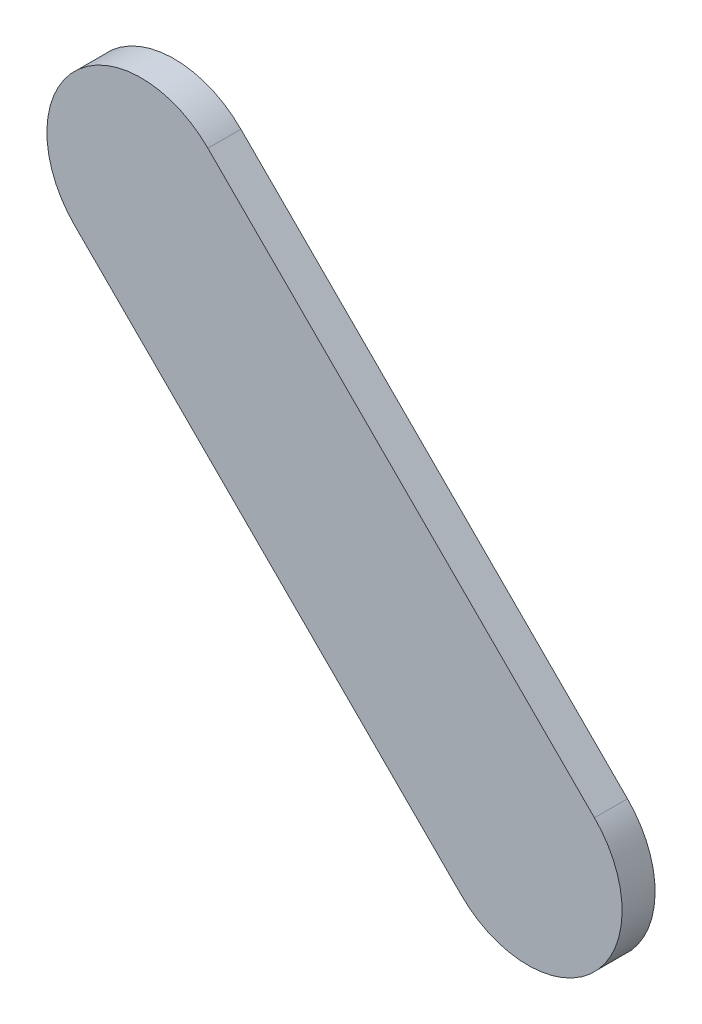
ISO-10303-21;
HEADER;
FILE_DESCRIPTION(('STEP AP214'),'2;1');
FILE_NAME('part.step','',(''),(''),'','','');
FILE_SCHEMA(('AUTOMOTIVE_DESIGN { 1 0 10303 214 1 1 1 1 }'));
ENDSEC;
DATA;
#1=APPLICATION_CONTEXT('core data for automotive mechanical design processes');
#2=APPLICATION_PROTOCOL_DEFINITION('international standard','automotive_design',2000,#1);
#3=PRODUCT_CONTEXT('',#1,'mechanical');
#4=PRODUCT('Part','Part','',(#3));
#5=PRODUCT_RELATED_PRODUCT_CATEGORY('part','',(#4));
#6=PRODUCT_DEFINITION_FORMATION('','',#4);
#7=PRODUCT_DEFINITION_CONTEXT('part definition',#1,'design');
#8=PRODUCT_DEFINITION('design','',#6,#7);
#9=PRODUCT_DEFINITION_SHAPE('','',#8);
#10=(LENGTH_UNIT() NAMED_UNIT(*) SI_UNIT(.MILLI.,.METRE.));
#11=(NAMED_UNIT(*) PLANE_ANGLE_UNIT() SI_UNIT($,.RADIAN.));
#12=(NAMED_UNIT(*) SI_UNIT($,.STERADIAN.) SOLID_ANGLE_UNIT());
#13=UNCERTAINTY_MEASURE_WITH_UNIT(LENGTH_MEASURE(1.E-05),#10,'distance_accuracy_value','');
#14=(GEOMETRIC_REPRESENTATION_CONTEXT(3) GLOBAL_UNCERTAINTY_ASSIGNED_CONTEXT((#13)) GLOBAL_UNIT_ASSIGNED_CONTEXT((#10,
#11,#12)) REPRESENTATION_CONTEXT('',''));
#15=CARTESIAN_POINT('',(0.,0.,0.));
#16=DIRECTION('',(0.,0.,1.));
#17=DIRECTION('',(1.,0.,0.));
#18=AXIS2_PLACEMENT_3D('',#15,#16,#17);
#19=CARTESIAN_POINT('',(95.07071,-123.479289,1.635));
#20=DIRECTION('',(0.,0.,1.));
#21=DIRECTION('',(1.,0.,0.));
#22=AXIS2_PLACEMENT_3D('',#19,#20,#21);
#23=PLANE('',#22);
#24=DIRECTION('',(-0.707106781186548,0.707106781186548,0.));
#25=VECTOR('',#24,1.);
#26=CARTESIAN_POINT('',(95.07071,-123.479289,1.635));
#27=LINE('',#26,#25);
#28=CARTESIAN_POINT('',(95.07071,-123.479289,1.635));
#29=VERTEX_POINT('',#28);
#30=CARTESIAN_POINT('',(94.66071,-123.069289,1.635));
#31=VERTEX_POINT('',#30);
#32=EDGE_CURVE('E97',#29,#31,#27,.T.);
#33=ORIENTED_EDGE('',*,*,#32,.T.);
#34=CARTESIAN_POINT('',(94.5899995,-123.1399995,1.635));
#35=DIRECTION('',(0.,0.,1.));
#36=DIRECTION('',(0.707106781186048,0.707106781187047,0.));
#37=AXIS2_PLACEMENT_3D('',#34,#35,#36);
#38=CIRCLE('',#37,0.09999974810219);
#39=CARTESIAN_POINT('',(94.519289,-123.21071,1.635));
#40=VERTEX_POINT('',#39);
#41=EDGE_CURVE('E76',#31,#40,#38,.T.);
#42=ORIENTED_EDGE('',*,*,#41,.T.);
#43=DIRECTION('',(0.707106781186548,-0.707106781186548,0.));
#44=VECTOR('',#43,1.);
#45=CARTESIAN_POINT('',(94.519289,-123.21071,1.635));
#46=LINE('',#45,#44);
#47=CARTESIAN_POINT('',(94.929289,-123.62071,1.635));
#48=VERTEX_POINT('',#47);
#49=EDGE_CURVE('E81',#40,#48,#46,.T.);
#50=ORIENTED_EDGE('',*,*,#49,.T.);
#51=CARTESIAN_POINT('',(94.9999995,-123.5499995,1.635));
#52=DIRECTION('',(0.,0.,1.));
#53=DIRECTION('',(-0.707106781186548,-0.707106781186548,0.));
#54=AXIS2_PLACEMENT_3D('',#51,#52,#53);
#55=CIRCLE('',#54,0.09999974810219);
#56=EDGE_CURVE('E11',#48,#29,#55,.T.);
#57=ORIENTED_EDGE('',*,*,#56,.T.);
#58=EDGE_LOOP('',(#33,#42,#50,#57));
#59=FACE_BOUND('',#58,.T.);
#60=ADVANCED_FACE('F17',(#59),#23,.T.);
#61=CARTESIAN_POINT('',(95.07071,-123.479289,1.6));
#62=DIRECTION('',(0.,0.,1.));
#63=DIRECTION('',(1.,0.,0.));
#64=AXIS2_PLACEMENT_3D('',#61,#62,#63);
#65=PLANE('',#64);
#66=CARTESIAN_POINT('',(94.9999995,-123.5499995,1.6));
#67=DIRECTION('',(0.,0.,1.));
#68=DIRECTION('',(-0.707106781186548,-0.707106781186548,0.));
#69=AXIS2_PLACEMENT_3D('',#66,#67,#68);
#70=CIRCLE('',#69,0.09999974810219);
#71=CARTESIAN_POINT('',(94.929289,-123.62071,1.6));
#72=VERTEX_POINT('',#71);
#73=CARTESIAN_POINT('',(95.07071,-123.479289,1.6));
#74=VERTEX_POINT('',#73);
#75=EDGE_CURVE('E25',#72,#74,#70,.T.);
#76=ORIENTED_EDGE('',*,*,#75,.F.);
#77=DIRECTION('',(0.707106781186548,-0.707106781186548,0.));
#78=VECTOR('',#77,1.);
#79=CARTESIAN_POINT('',(94.519289,-123.21071,1.6));
#80=LINE('',#79,#78);
#81=CARTESIAN_POINT('',(94.519289,-123.21071,1.6));
#82=VERTEX_POINT('',#81);
#83=EDGE_CURVE('E66',#82,#72,#80,.T.);
#84=ORIENTED_EDGE('',*,*,#83,.F.);
#85=CARTESIAN_POINT('',(94.5899995,-123.1399995,1.6));
#86=DIRECTION('',(0.,0.,1.));
#87=DIRECTION('',(0.707106781186048,0.707106781187047,0.));
#88=AXIS2_PLACEMENT_3D('',#85,#86,#87);
#89=CIRCLE('',#88,0.09999974810219);
#90=CARTESIAN_POINT('',(94.66071,-123.069289,1.6));
#91=VERTEX_POINT('',#90);
#92=EDGE_CURVE('E70',#91,#82,#89,.T.);
#93=ORIENTED_EDGE('',*,*,#92,.F.);
#94=DIRECTION('',(-0.707106781186548,0.707106781186548,0.));
#95=VECTOR('',#94,1.);
#96=CARTESIAN_POINT('',(95.07071,-123.479289,1.6));
#97=LINE('',#96,#95);
#98=EDGE_CURVE('E114',#74,#91,#97,.T.);
#99=ORIENTED_EDGE('',*,*,#98,.F.);
#100=EDGE_LOOP('',(#76,#84,#93,#99));
#101=FACE_BOUND('',#100,.T.);
#102=ADVANCED_FACE('F68',(#101),#65,.F.);
#103=CARTESIAN_POINT('',(94.9999995,-123.5499995,1.6));
#104=DIRECTION('',(0.,0.,-1.));
#105=DIRECTION('',(-0.707106781186548,-0.707106781186548,0.));
#106=AXIS2_PLACEMENT_3D('',#103,#104,#105);
#107=CYLINDRICAL_SURFACE('',#106,0.09999974810219);
#108=ORIENTED_EDGE('',*,*,#75,.T.);
#109=DIRECTION('',(0.,0.,1.));
#110=VECTOR('',#109,1.);
#111=CARTESIAN_POINT('',(95.07071,-123.479289,1.6));
#112=LINE('',#111,#110);
#113=EDGE_CURVE('E91',#74,#29,#112,.T.);
#114=ORIENTED_EDGE('',*,*,#113,.T.);
#115=ORIENTED_EDGE('',*,*,#56,.F.);
#116=DIRECTION('',(0.,0.,1.));
#117=VECTOR('',#116,1.);
#118=CARTESIAN_POINT('',(94.929289,-123.62071,1.6));
#119=LINE('',#118,#117);
#120=EDGE_CURVE('E75',#72,#48,#119,.T.);
#121=ORIENTED_EDGE('',*,*,#120,.F.);
#122=EDGE_LOOP('',(#108,#114,#115,#121));
#123=FACE_BOUND('',#122,.T.);
#124=ADVANCED_FACE('F110',(#123),#107,.T.);
#125=CARTESIAN_POINT('',(94.519289,-123.21071,1.6));
#126=DIRECTION('',(0.707106781186548,0.707106781186548,0.));
#127=DIRECTION('',(0.,0.,-1.));
#128=AXIS2_PLACEMENT_3D('',#125,#126,#127);
#129=PLANE('',#128);
#130=ORIENTED_EDGE('',*,*,#83,.T.);
#131=ORIENTED_EDGE('',*,*,#120,.T.);
#132=ORIENTED_EDGE('',*,*,#49,.F.);
#133=DIRECTION('',(0.,0.,1.));
#134=VECTOR('',#133,1.);
#135=CARTESIAN_POINT('',(94.519289,-123.21071,1.6));
#136=LINE('',#135,#134);
#137=EDGE_CURVE('E79',#82,#40,#136,.T.);
#138=ORIENTED_EDGE('',*,*,#137,.F.);
#139=EDGE_LOOP('',(#130,#131,#132,#138));
#140=FACE_BOUND('',#139,.T.);
#141=ADVANCED_FACE('F80',(#140),#129,.F.);
#142=CARTESIAN_POINT('',(94.5899995,-123.1399995,1.6));
#143=DIRECTION('',(0.,0.,-1.));
#144=DIRECTION('',(0.707106781186048,0.707106781187048,0.));
#145=AXIS2_PLACEMENT_3D('',#142,#143,#144);
#146=CYLINDRICAL_SURFACE('',#145,0.09999974810219);
#147=ORIENTED_EDGE('',*,*,#92,.T.);
#148=ORIENTED_EDGE('',*,*,#137,.T.);
#149=ORIENTED_EDGE('',*,*,#41,.F.);
#150=DIRECTION('',(0.,0.,1.));
#151=VECTOR('',#150,1.);
#152=CARTESIAN_POINT('',(94.66071,-123.069289,1.6));
#153=LINE('',#152,#151);
#154=EDGE_CURVE('E88',#91,#31,#153,.T.);
#155=ORIENTED_EDGE('',*,*,#154,.F.);
#156=EDGE_LOOP('',(#147,#148,#149,#155));
#157=FACE_BOUND('',#156,.T.);
#158=ADVANCED_FACE('F86',(#157),#146,.T.);
#159=CARTESIAN_POINT('',(95.07071,-123.479289,1.6));
#160=DIRECTION('',(-0.707106781186548,-0.707106781186548,0.));
#161=DIRECTION('',(-0.707106781186548,0.707106781186548,0.));
#162=AXIS2_PLACEMENT_3D('',#159,#160,#161);
#163=PLANE('',#162);
#164=ORIENTED_EDGE('',*,*,#98,.T.);
#165=ORIENTED_EDGE('',*,*,#154,.T.);
#166=ORIENTED_EDGE('',*,*,#32,.F.);
#167=ORIENTED_EDGE('',*,*,#113,.F.);
#168=EDGE_LOOP('',(#164,#165,#166,#167));
#169=FACE_BOUND('',#168,.T.);
#170=ADVANCED_FACE('F113',(#169),#163,.F.);
#171=CLOSED_SHELL('',(#60,#102,#124,#141,#158,#170));
#172=MANIFOLD_SOLID_BREP('B1',#171);
#173=ADVANCED_BREP_SHAPE_REPRESENTATION('',(#18,#172),#14);
#174=SHAPE_DEFINITION_REPRESENTATION(#9,#173);
ENDSEC;
END-ISO-10303-21;
